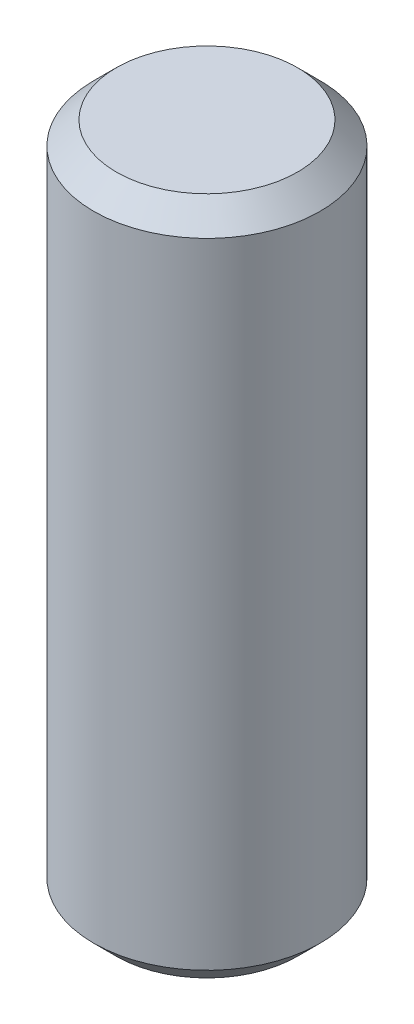
ISO-10303-21;
HEADER;
FILE_DESCRIPTION(('STEP AP214'),'2;1');
FILE_NAME('part.step','',(''),(''),'','','');
FILE_SCHEMA(('AUTOMOTIVE_DESIGN { 1 0 10303 214 1 1 1 1 }'));
ENDSEC;
DATA;
#1=APPLICATION_CONTEXT('core data for automotive mechanical design processes');
#2=APPLICATION_PROTOCOL_DEFINITION('international standard','automotive_design',2000,#1);
#3=PRODUCT_CONTEXT('',#1,'mechanical');
#4=PRODUCT('Part','Part','',(#3));
#5=PRODUCT_RELATED_PRODUCT_CATEGORY('part','',(#4));
#6=PRODUCT_DEFINITION_FORMATION('','',#4);
#7=PRODUCT_DEFINITION_CONTEXT('part definition',#1,'design');
#8=PRODUCT_DEFINITION('design','',#6,#7);
#9=PRODUCT_DEFINITION_SHAPE('','',#8);
#10=(LENGTH_UNIT() NAMED_UNIT(*) SI_UNIT(.MILLI.,.METRE.));
#11=(NAMED_UNIT(*) PLANE_ANGLE_UNIT() SI_UNIT($,.RADIAN.));
#12=(NAMED_UNIT(*) SI_UNIT($,.STERADIAN.) SOLID_ANGLE_UNIT());
#13=UNCERTAINTY_MEASURE_WITH_UNIT(LENGTH_MEASURE(1.E-05),#10,'distance_accuracy_value','');
#14=(GEOMETRIC_REPRESENTATION_CONTEXT(3) GLOBAL_UNCERTAINTY_ASSIGNED_CONTEXT((#13)) GLOBAL_UNIT_ASSIGNED_CONTEXT((#10,
#11,#12)) REPRESENTATION_CONTEXT('',''));
#15=CARTESIAN_POINT('',(0.,0.,0.));
#16=DIRECTION('',(0.,0.,1.));
#17=DIRECTION('',(1.,0.,0.));
#18=AXIS2_PLACEMENT_3D('',#15,#16,#17);
#19=CARTESIAN_POINT('',(0.,3.,0.));
#20=DIRECTION('',(0.,-1.,0.));
#21=DIRECTION('',(0.,0.,-1.00000000000001));
#22=AXIS2_PLACEMENT_3D('',#19,#20,#21);
#23=CYLINDRICAL_SURFACE('',#22,0.5);
#24=CARTESIAN_POINT('',(0.,0.099999999999989,0.));
#25=DIRECTION('',(0.,1.,0.));
#26=DIRECTION('',(0.,0.,1.00000000000001));
#27=AXIS2_PLACEMENT_3D('',#24,#25,#26);
#28=CIRCLE('',#27,0.5);
#29=CARTESIAN_POINT('',(0.,0.099999999999989,0.500000000000004));
#30=VERTEX_POINT('',#29);
#31=EDGE_CURVE('E50',#30,#30,#28,.T.);
#32=ORIENTED_EDGE('',*,*,#31,.T.);
#33=EDGE_LOOP('',(#32));
#34=FACE_BOUND('',#33,.T.);
#35=CARTESIAN_POINT('',(0.,2.90000000000001,0.));
#36=DIRECTION('',(0.,1.,0.));
#37=DIRECTION('',(0.,0.,1.00000000000001));
#38=AXIS2_PLACEMENT_3D('',#35,#36,#37);
#39=CIRCLE('',#38,0.5);
#40=CARTESIAN_POINT('',(0.,2.90000000000001,0.500000000000004));
#41=VERTEX_POINT('',#40);
#42=EDGE_CURVE('E54',#41,#41,#39,.F.);
#43=ORIENTED_EDGE('',*,*,#42,.T.);
#44=EDGE_LOOP('',(#43));
#45=FACE_BOUND('',#44,.T.);
#46=ADVANCED_FACE('F38',(#34,#45),#23,.T.);
#47=CARTESIAN_POINT('',(0.,3.,0.));
#48=DIRECTION('',(0.,1.,0.));
#49=DIRECTION('',(0.,0.,1.00000000000001));
#50=AXIS2_PLACEMENT_3D('',#47,#48,#49);
#51=PLANE('',#50);
#52=CARTESIAN_POINT('',(0.,3.,0.));
#53=DIRECTION('',(0.,1.,0.));
#54=DIRECTION('',(0.,0.,1.00000000000001));
#55=AXIS2_PLACEMENT_3D('',#52,#53,#54);
#56=CIRCLE('',#55,0.4);
#57=CARTESIAN_POINT('',(0.,3.,0.400000000000003));
#58=VERTEX_POINT('',#57);
#59=EDGE_CURVE('E10',#58,#58,#56,.T.);
#60=ORIENTED_EDGE('',*,*,#59,.T.);
#61=EDGE_LOOP('',(#60));
#62=FACE_BOUND('',#61,.T.);
#63=ADVANCED_FACE('F71',(#62),#51,.T.);
#64=CARTESIAN_POINT('',(0.,0.,0.));
#65=DIRECTION('',(0.,1.,0.));
#66=DIRECTION('',(0.,0.,1.00000000000001));
#67=AXIS2_PLACEMENT_3D('',#64,#65,#66);
#68=PLANE('',#67);
#69=CARTESIAN_POINT('',(0.,0.,0.));
#70=DIRECTION('',(0.,1.,0.));
#71=DIRECTION('',(0.,0.,1.00000000000001));
#72=AXIS2_PLACEMENT_3D('',#69,#70,#71);
#73=CIRCLE('',#72,0.4);
#74=CARTESIAN_POINT('',(0.,0.,0.400000000000002));
#75=VERTEX_POINT('',#74);
#76=EDGE_CURVE('E46',#75,#75,#73,.F.);
#77=ORIENTED_EDGE('',*,*,#76,.T.);
#78=EDGE_LOOP('',(#77));
#79=FACE_BOUND('',#78,.T.);
#80=ADVANCED_FACE('F68',(#79),#68,.F.);
#81=CARTESIAN_POINT('',(0.,0.099999999999989,0.));
#82=DIRECTION('',(0.,1.,0.));
#83=DIRECTION('',(0.,0.,1.00000000000001));
#84=AXIS2_PLACEMENT_3D('',#81,#82,#83);
#85=CONICAL_SURFACE('',#84,0.5,0.785398163397451);
#86=ORIENTED_EDGE('',*,*,#76,.F.);
#87=EDGE_LOOP('',(#86));
#88=FACE_BOUND('',#87,.T.);
#89=ORIENTED_EDGE('',*,*,#31,.F.);
#90=EDGE_LOOP('',(#89));
#91=FACE_BOUND('',#90,.T.);
#92=ADVANCED_FACE('F63',(#88,#91),#85,.T.);
#93=CARTESIAN_POINT('',(0.,3.,0.));
#94=DIRECTION('',(0.,-1.,0.));
#95=DIRECTION('',(0.,0.,-1.00000000000001));
#96=AXIS2_PLACEMENT_3D('',#93,#94,#95);
#97=CONICAL_SURFACE('',#96,0.4,0.785398163397446);
#98=ORIENTED_EDGE('',*,*,#42,.F.);
#99=EDGE_LOOP('',(#98));
#100=FACE_BOUND('',#99,.T.);
#101=ORIENTED_EDGE('',*,*,#59,.F.);
#102=EDGE_LOOP('',(#101));
#103=FACE_BOUND('',#102,.T.);
#104=ADVANCED_FACE('F41',(#100,#103),#97,.T.);
#105=CLOSED_SHELL('',(#46,#63,#80,#92,#104));
#106=MANIFOLD_SOLID_BREP('B2',#105);
#107=ADVANCED_BREP_SHAPE_REPRESENTATION('',(#18,#106),#14);
#108=SHAPE_DEFINITION_REPRESENTATION(#9,#107);
ENDSEC;
END-ISO-10303-21;
